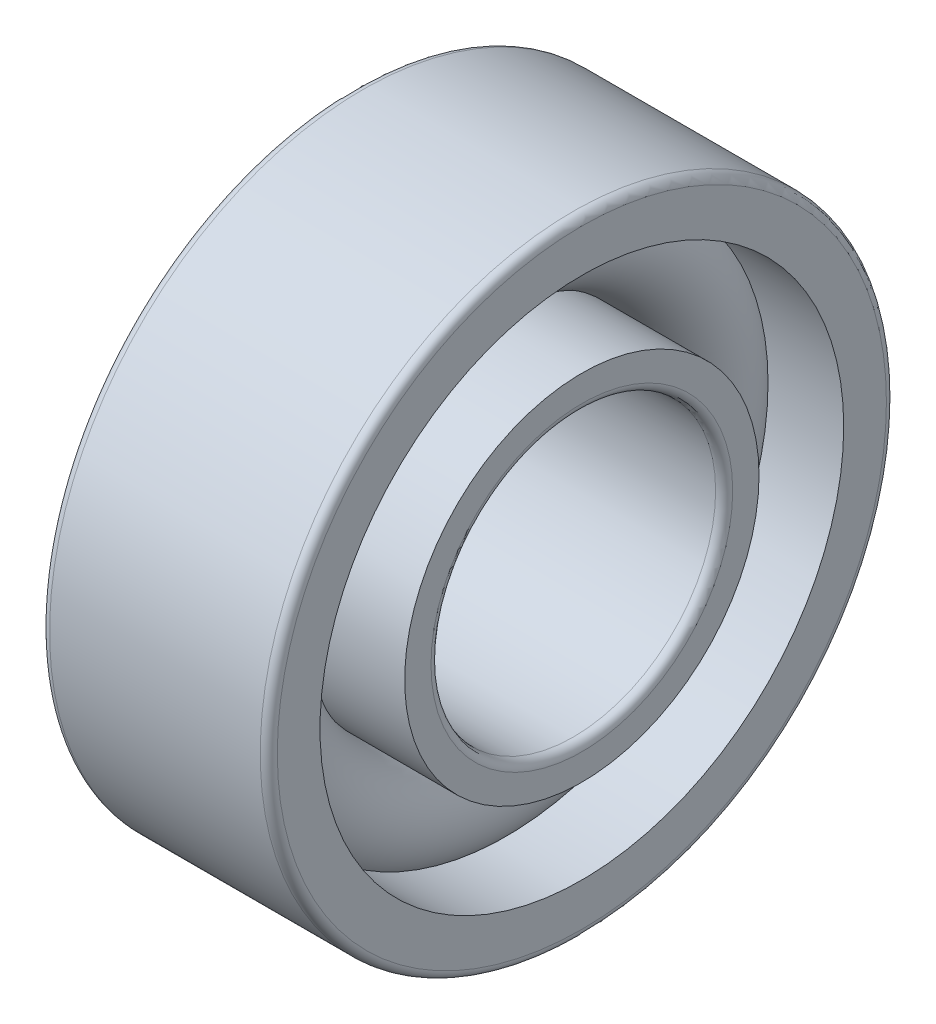
ISO-10303-21;
HEADER;
FILE_DESCRIPTION(('STEP AP214'),'2;1');
FILE_NAME('part.step','',(''),(''),'','','');
FILE_SCHEMA(('AUTOMOTIVE_DESIGN { 1 0 10303 214 1 1 1 1 }'));
ENDSEC;
DATA;
#1=APPLICATION_CONTEXT('core data for automotive mechanical design processes');
#2=APPLICATION_PROTOCOL_DEFINITION('international standard','automotive_design',2000,#1);
#3=PRODUCT_CONTEXT('',#1,'mechanical');
#4=PRODUCT('Part','Part','',(#3));
#5=PRODUCT_RELATED_PRODUCT_CATEGORY('part','',(#4));
#6=PRODUCT_DEFINITION_FORMATION('','',#4);
#7=PRODUCT_DEFINITION_CONTEXT('part definition',#1,'design');
#8=PRODUCT_DEFINITION('design','',#6,#7);
#9=PRODUCT_DEFINITION_SHAPE('','',#8);
#10=(LENGTH_UNIT() NAMED_UNIT(*) SI_UNIT(.MILLI.,.METRE.));
#11=(NAMED_UNIT(*) PLANE_ANGLE_UNIT() SI_UNIT($,.RADIAN.));
#12=(NAMED_UNIT(*) SI_UNIT($,.STERADIAN.) SOLID_ANGLE_UNIT());
#13=UNCERTAINTY_MEASURE_WITH_UNIT(LENGTH_MEASURE(1.E-05),#10,'distance_accuracy_value','');
#14=(GEOMETRIC_REPRESENTATION_CONTEXT(3) GLOBAL_UNCERTAINTY_ASSIGNED_CONTEXT((#13)) GLOBAL_UNIT_ASSIGNED_CONTEXT((#10,
#11,#12)) REPRESENTATION_CONTEXT('',''));
#15=CARTESIAN_POINT('',(0.,0.,0.));
#16=DIRECTION('',(0.,0.,1.));
#17=DIRECTION('',(1.,0.,0.));
#18=AXIS2_PLACEMENT_3D('',#15,#16,#17);
#19=CARTESIAN_POINT('',(-35.4553710150989,9.78232897185181,12.0633461283654));
#20=DIRECTION('',(-1.,0.,0.));
#21=DIRECTION('',(0.,0.,1.));
#22=AXIS2_PLACEMENT_3D('',#19,#20,#21);
#23=TOROIDAL_SURFACE('',#22,8.,1.8);
#24=CARTESIAN_POINT('',(-34.1137302285989,9.78232897185151,12.0633461283654));
#25=DIRECTION('',(-1.,0.,0.));
#26=DIRECTION('',(0.,0.,1.));
#27=AXIS2_PLACEMENT_3D('',#24,#25,#26);
#28=CIRCLE('',#27,9.2);
#29=CARTESIAN_POINT('',(-34.1137302285989,9.78232897185152,21.2633461283654));
#30=VERTEX_POINT('',#29);
#31=EDGE_CURVE('E43',#30,#30,#28,.F.);
#32=ORIENTED_EDGE('',*,*,#31,.T.);
#33=EDGE_LOOP('',(#32));
#34=FACE_BOUND('',#33,.T.);
#35=CARTESIAN_POINT('',(-35.1564144965214,9.78232897185134,12.0633461283651));
#36=DIRECTION('',(-1.,0.,0.));
#37=DIRECTION('',(0.,0.,1.));
#38=AXIS2_PLACEMENT_3D('',#35,#36,#37);
#39=CIRCLE('',#38,6.225);
#40=CARTESIAN_POINT('',(-35.1564144965214,9.78232897185135,18.2883461283651));
#41=VERTEX_POINT('',#40);
#42=EDGE_CURVE('E10',#41,#41,#39,.T.);
#43=ORIENTED_EDGE('',*,*,#42,.T.);
#44=EDGE_LOOP('',(#43));
#45=FACE_BOUND('',#44,.T.);
#46=ADVANCED_FACE('F39',(#34,#45),#23,.T.);
#47=CARTESIAN_POINT('',(-56.0928710150989,9.78232897185134,12.0633461283651));
#48=DIRECTION('',(1.,0.,0.));
#49=DIRECTION('',(0.,0.,-1.));
#50=AXIS2_PLACEMENT_3D('',#47,#48,#49);
#51=CYLINDRICAL_SURFACE('',#50,6.225);
#52=CARTESIAN_POINT('',(-31.4553710150987,9.78232897185162,12.0633461283652));
#53=DIRECTION('',(1.,0.,0.));
#54=DIRECTION('',(0.,0.,-1.));
#55=AXIS2_PLACEMENT_3D('',#52,#53,#54);
#56=CIRCLE('',#55,6.225);
#57=CARTESIAN_POINT('',(-31.4553710150987,9.78232897185161,5.83834612836516));
#58=VERTEX_POINT('',#57);
#59=EDGE_CURVE('E54',#58,#58,#56,.T.);
#60=ORIENTED_EDGE('',*,*,#59,.F.);
#61=EDGE_LOOP('',(#60));
#62=FACE_BOUND('',#61,.T.);
#63=ORIENTED_EDGE('',*,*,#42,.F.);
#64=EDGE_LOOP('',(#63));
#65=FACE_BOUND('',#64,.T.);
#66=ADVANCED_FACE('F103',(#62,#65),#51,.T.);
#67=CARTESIAN_POINT('',(-56.0928710150989,9.78232897185134,12.0633461283651));
#68=DIRECTION('',(1.,0.,0.));
#69=DIRECTION('',(0.,0.,-1.));
#70=AXIS2_PLACEMENT_3D('',#67,#68,#69);
#71=CYLINDRICAL_SURFACE('',#70,6.8);
#72=CARTESIAN_POINT('',(-39.4553710150989,9.78232897185173,12.0633461283655));
#73=DIRECTION('',(1.,0.,0.));
#74=DIRECTION('',(0.,0.,-1.));
#75=AXIS2_PLACEMENT_3D('',#72,#73,#74);
#76=CIRCLE('',#75,6.8);
#77=CARTESIAN_POINT('',(-39.4553710150989,9.78232897185172,5.26334612836549));
#78=VERTEX_POINT('',#77);
#79=EDGE_CURVE('E66',#78,#78,#76,.T.);
#80=ORIENTED_EDGE('',*,*,#79,.T.);
#81=EDGE_LOOP('',(#80));
#82=FACE_BOUND('',#81,.T.);
#83=CARTESIAN_POINT('',(-36.7970118015986,9.78232897185134,12.0633461283652));
#84=DIRECTION('',(1.,0.,0.));
#85=DIRECTION('',(0.,0.,-1.));
#86=AXIS2_PLACEMENT_3D('',#83,#84,#85);
#87=CIRCLE('',#86,6.8);
#88=CARTESIAN_POINT('',(-36.7970118015986,9.78232897185133,5.26334612836516));
#89=VERTEX_POINT('',#88);
#90=EDGE_CURVE('E48',#89,#89,#87,.T.);
#91=ORIENTED_EDGE('',*,*,#90,.F.);
#92=EDGE_LOOP('',(#91));
#93=FACE_BOUND('',#92,.T.);
#94=ADVANCED_FACE('F106',(#82,#93),#71,.T.);
#95=CARTESIAN_POINT('',(-31.4553710150989,15.0823289718513,12.0633461283653));
#96=DIRECTION('',(1.,0.,0.));
#97=DIRECTION('',(0.,0.,-1.));
#98=AXIS2_PLACEMENT_3D('',#95,#96,#97);
#99=PLANE('',#98);
#100=ORIENTED_EDGE('',*,*,#59,.T.);
#101=EDGE_LOOP('',(#100));
#102=FACE_BOUND('',#101,.T.);
#103=CARTESIAN_POINT('',(-31.4553710150987,9.78232897185162,12.0633461283652));
#104=DIRECTION('',(1.,0.,0.));
#105=DIRECTION('',(0.,0.,-1.));
#106=AXIS2_PLACEMENT_3D('',#103,#104,#105);
#107=CIRCLE('',#106,5.3);
#108=CARTESIAN_POINT('',(-31.4553710150987,9.78232897185161,6.76334612836516));
#109=VERTEX_POINT('',#108);
#110=EDGE_CURVE('E93',#109,#109,#107,.T.);
#111=ORIENTED_EDGE('',*,*,#110,.F.);
#112=EDGE_LOOP('',(#111));
#113=FACE_BOUND('',#112,.T.);
#114=ADVANCED_FACE('F100',(#102,#113),#99,.T.);
#115=CARTESIAN_POINT('',(-31.7553710150989,9.78232897185173,12.0633461283654));
#116=DIRECTION('',(1.,0.,0.));
#117=DIRECTION('',(0.,0.,-1.));
#118=AXIS2_PLACEMENT_3D('',#115,#116,#117);
#119=TOROIDAL_SURFACE('',#118,5.3,0.300000000000001);
#120=ORIENTED_EDGE('',*,*,#110,.T.);
#121=EDGE_LOOP('',(#120));
#122=FACE_BOUND('',#121,.T.);
#123=CARTESIAN_POINT('',(-31.7553710150989,9.78232897185173,12.0633461283654));
#124=DIRECTION('',(1.,0.,0.));
#125=DIRECTION('',(0.,0.,-1.));
#126=AXIS2_PLACEMENT_3D('',#123,#124,#125);
#127=CIRCLE('',#126,5.);
#128=CARTESIAN_POINT('',(-31.7553710150989,9.78232897185172,7.06334612836544));
#129=VERTEX_POINT('',#128);
#130=EDGE_CURVE('E89',#129,#129,#127,.T.);
#131=ORIENTED_EDGE('',*,*,#130,.F.);
#132=EDGE_LOOP('',(#131));
#133=FACE_BOUND('',#132,.T.);
#134=ADVANCED_FACE('F117',(#122,#133),#119,.T.);
#135=CARTESIAN_POINT('',(-56.0928710150989,9.78232897185134,12.0633461283651));
#136=DIRECTION('',(1.,0.,0.));
#137=DIRECTION('',(0.,0.,-1.));
#138=AXIS2_PLACEMENT_3D('',#135,#136,#137);
#139=CYLINDRICAL_SURFACE('',#138,5.);
#140=ORIENTED_EDGE('',*,*,#130,.T.);
#141=EDGE_LOOP('',(#140));
#142=FACE_BOUND('',#141,.T.);
#143=CARTESIAN_POINT('',(-39.1553710150986,9.78232897185137,12.0633461283654));
#144=DIRECTION('',(1.,0.,0.));
#145=DIRECTION('',(0.,0.,-1.));
#146=AXIS2_PLACEMENT_3D('',#143,#144,#145);
#147=CIRCLE('',#146,5.);
#148=CARTESIAN_POINT('',(-39.1553710150986,9.78232897185136,7.06334612836538));
#149=VERTEX_POINT('',#148);
#150=EDGE_CURVE('E85',#149,#149,#147,.T.);
#151=ORIENTED_EDGE('',*,*,#150,.F.);
#152=EDGE_LOOP('',(#151));
#153=FACE_BOUND('',#152,.T.);
#154=ADVANCED_FACE('F120',(#142,#153),#139,.F.);
#155=CARTESIAN_POINT('',(-39.1553710150986,9.78232897185137,12.0633461283654));
#156=DIRECTION('',(1.,0.,0.));
#157=DIRECTION('',(0.,0.,-1.));
#158=AXIS2_PLACEMENT_3D('',#155,#156,#157);
#159=TOROIDAL_SURFACE('',#158,5.3,0.300000000000001);
#160=ORIENTED_EDGE('',*,*,#150,.T.);
#161=EDGE_LOOP('',(#160));
#162=FACE_BOUND('',#161,.T.);
#163=CARTESIAN_POINT('',(-39.4553710150989,9.78232897185173,12.0633461283655));
#164=DIRECTION('',(1.,0.,0.));
#165=DIRECTION('',(0.,0.,-1.));
#166=AXIS2_PLACEMENT_3D('',#163,#164,#165);
#167=CIRCLE('',#166,5.3);
#168=CARTESIAN_POINT('',(-39.4553710150989,9.78232897185172,6.76334612836549));
#169=VERTEX_POINT('',#168);
#170=EDGE_CURVE('E81',#169,#169,#167,.T.);
#171=ORIENTED_EDGE('',*,*,#170,.F.);
#172=EDGE_LOOP('',(#171));
#173=FACE_BOUND('',#172,.T.);
#174=ADVANCED_FACE('F124',(#162,#173),#159,.T.);
#175=CARTESIAN_POINT('',(-39.4553710150987,16.5823289718514,12.0633461283652));
#176=DIRECTION('',(-1.,0.,0.));
#177=DIRECTION('',(0.,0.,1.));
#178=AXIS2_PLACEMENT_3D('',#175,#176,#177);
#179=PLANE('',#178);
#180=ORIENTED_EDGE('',*,*,#170,.T.);
#181=EDGE_LOOP('',(#180));
#182=FACE_BOUND('',#181,.T.);
#183=ORIENTED_EDGE('',*,*,#79,.F.);
#184=EDGE_LOOP('',(#183));
#185=FACE_BOUND('',#184,.T.);
#186=ADVANCED_FACE('F128',(#182,#185),#179,.T.);
#187=CARTESIAN_POINT('',(-35.7543275336763,9.78232897185134,12.0633461283654));
#188=DIRECTION('',(1.,0.,0.));
#189=DIRECTION('',(0.,0.,-1.));
#190=AXIS2_PLACEMENT_3D('',#187,#188,#189);
#191=CIRCLE('',#190,9.775);
#192=CARTESIAN_POINT('',(-35.7543275336763,9.78232897185133,2.28834612836537));
#193=VERTEX_POINT('',#192);
#194=EDGE_CURVE('E57',#193,#193,#191,.F.);
#195=ORIENTED_EDGE('',*,*,#194,.T.);
#196=EDGE_LOOP('',(#195));
#197=FACE_BOUND('',#196,.T.);
#198=ORIENTED_EDGE('',*,*,#90,.T.);
#199=EDGE_LOOP('',(#198));
#200=FACE_BOUND('',#199,.T.);
#201=ADVANCED_FACE('F41',(#197,#200),#23,.T.);
#202=CARTESIAN_POINT('',(-56.0928710150989,9.78232897185134,12.0633461283651));
#203=DIRECTION('',(1.,0.,0.));
#204=DIRECTION('',(0.,0.,-1.));
#205=AXIS2_PLACEMENT_3D('',#202,#203,#204);
#206=CYLINDRICAL_SURFACE('',#205,9.2);
#207=CARTESIAN_POINT('',(-31.4553710150987,9.78232897185162,12.0633461283652));
#208=DIRECTION('',(1.,0.,0.));
#209=DIRECTION('',(0.,0.,-1.));
#210=AXIS2_PLACEMENT_3D('',#207,#208,#209);
#211=CIRCLE('',#210,9.2);
#212=CARTESIAN_POINT('',(-31.4553710150987,9.78232897185161,2.86334612836515));
#213=VERTEX_POINT('',#212);
#214=EDGE_CURVE('E171',#213,#213,#211,.T.);
#215=ORIENTED_EDGE('',*,*,#214,.T.);
#216=EDGE_LOOP('',(#215));
#217=FACE_BOUND('',#216,.T.);
#218=ORIENTED_EDGE('',*,*,#31,.F.);
#219=EDGE_LOOP('',(#218));
#220=FACE_BOUND('',#219,.T.);
#221=ADVANCED_FACE('F150',(#217,#220),#206,.F.);
#222=CARTESIAN_POINT('',(-56.0928710150989,9.78232897185134,12.0633461283651));
#223=DIRECTION('',(1.,0.,0.));
#224=DIRECTION('',(0.,0.,-1.));
#225=AXIS2_PLACEMENT_3D('',#222,#223,#224);
#226=CYLINDRICAL_SURFACE('',#225,9.775);
#227=CARTESIAN_POINT('',(-39.4553710150989,9.78232897185173,12.0633461283655));
#228=DIRECTION('',(1.,0.,0.));
#229=DIRECTION('',(0.,0.,-1.));
#230=AXIS2_PLACEMENT_3D('',#227,#228,#229);
#231=CIRCLE('',#230,9.775);
#232=CARTESIAN_POINT('',(-39.4553710150989,9.78232897185172,2.28834612836548));
#233=VERTEX_POINT('',#232);
#234=EDGE_CURVE('E164',#233,#233,#231,.T.);
#235=ORIENTED_EDGE('',*,*,#234,.F.);
#236=EDGE_LOOP('',(#235));
#237=FACE_BOUND('',#236,.T.);
#238=ORIENTED_EDGE('',*,*,#194,.F.);
#239=EDGE_LOOP('',(#238));
#240=FACE_BOUND('',#239,.T.);
#241=ADVANCED_FACE('F137',(#237,#240),#226,.F.);
#242=CARTESIAN_POINT('',(-39.1553710150986,9.78232897185137,12.0633461283654));
#243=DIRECTION('',(1.,0.,0.));
#244=DIRECTION('',(0.,0.,-1.));
#245=AXIS2_PLACEMENT_3D('',#242,#243,#244);
#246=TOROIDAL_SURFACE('',#245,10.7,0.3);
#247=CARTESIAN_POINT('',(-39.4553710150989,9.78232897185173,12.0633461283655));
#248=DIRECTION('',(1.,0.,0.));
#249=DIRECTION('',(0.,0.,-1.));
#250=AXIS2_PLACEMENT_3D('',#247,#248,#249);
#251=CIRCLE('',#250,10.7);
#252=CARTESIAN_POINT('',(-39.4553710150989,9.78232897185172,1.36334612836548));
#253=VERTEX_POINT('',#252);
#254=EDGE_CURVE('E167',#253,#253,#251,.T.);
#255=ORIENTED_EDGE('',*,*,#254,.T.);
#256=EDGE_LOOP('',(#255));
#257=FACE_BOUND('',#256,.T.);
#258=CARTESIAN_POINT('',(-39.1553710150986,9.78232897185137,12.0633461283654));
#259=DIRECTION('',(1.,0.,0.));
#260=DIRECTION('',(0.,0.,-1.));
#261=AXIS2_PLACEMENT_3D('',#258,#259,#260);
#262=CIRCLE('',#261,11.);
#263=CARTESIAN_POINT('',(-39.1553710150986,9.78232897185136,1.06334612836537));
#264=VERTEX_POINT('',#263);
#265=EDGE_CURVE('E60',#264,#264,#262,.T.);
#266=ORIENTED_EDGE('',*,*,#265,.F.);
#267=EDGE_LOOP('',(#266));
#268=FACE_BOUND('',#267,.T.);
#269=ADVANCED_FACE('F133',(#257,#268),#246,.T.);
#270=CARTESIAN_POINT('',(-56.0928710150989,9.78232897185134,12.0633461283651));
#271=DIRECTION('',(1.,0.,0.));
#272=DIRECTION('',(0.,0.,-1.));
#273=AXIS2_PLACEMENT_3D('',#270,#271,#272);
#274=CYLINDRICAL_SURFACE('',#273,11.);
#275=ORIENTED_EDGE('',*,*,#265,.T.);
#276=EDGE_LOOP('',(#275));
#277=FACE_BOUND('',#276,.T.);
#278=CARTESIAN_POINT('',(-31.7553710150989,9.78232897185173,12.0633461283654));
#279=DIRECTION('',(1.,0.,0.));
#280=DIRECTION('',(0.,0.,-1.));
#281=AXIS2_PLACEMENT_3D('',#278,#279,#280);
#282=CIRCLE('',#281,11.);
#283=CARTESIAN_POINT('',(-31.7553710150989,9.78232897185172,1.06334612836543));
#284=VERTEX_POINT('',#283);
#285=EDGE_CURVE('E68',#284,#284,#282,.T.);
#286=ORIENTED_EDGE('',*,*,#285,.F.);
#287=EDGE_LOOP('',(#286));
#288=FACE_BOUND('',#287,.T.);
#289=ADVANCED_FACE('F136',(#277,#288),#274,.T.);
#290=CARTESIAN_POINT('',(-31.7553710150989,9.78232897185173,12.0633461283654));
#291=DIRECTION('',(1.,0.,0.));
#292=DIRECTION('',(0.,0.,-1.));
#293=AXIS2_PLACEMENT_3D('',#290,#291,#292);
#294=TOROIDAL_SURFACE('',#293,10.7,0.3);
#295=ORIENTED_EDGE('',*,*,#285,.T.);
#296=EDGE_LOOP('',(#295));
#297=FACE_BOUND('',#296,.T.);
#298=CARTESIAN_POINT('',(-31.4553710150987,9.78232897185162,12.0633461283652));
#299=DIRECTION('',(1.,0.,0.));
#300=DIRECTION('',(0.,0.,-1.));
#301=AXIS2_PLACEMENT_3D('',#298,#299,#300);
#302=CIRCLE('',#301,10.7);
#303=CARTESIAN_POINT('',(-31.4553710150987,9.78232897185161,1.36334612836515));
#304=VERTEX_POINT('',#303);
#305=EDGE_CURVE('E74',#304,#304,#302,.T.);
#306=ORIENTED_EDGE('',*,*,#305,.F.);
#307=EDGE_LOOP('',(#306));
#308=FACE_BOUND('',#307,.T.);
#309=ADVANCED_FACE('F141',(#297,#308),#294,.T.);
#310=CARTESIAN_POINT('',(-31.4553710150988,20.4823289718516,12.0633461283654));
#311=DIRECTION('',(1.,0.,0.));
#312=DIRECTION('',(0.,0.,-1.));
#313=AXIS2_PLACEMENT_3D('',#310,#311,#312);
#314=PLANE('',#313);
#315=ORIENTED_EDGE('',*,*,#305,.T.);
#316=EDGE_LOOP('',(#315));
#317=FACE_BOUND('',#316,.T.);
#318=ORIENTED_EDGE('',*,*,#214,.F.);
#319=EDGE_LOOP('',(#318));
#320=FACE_BOUND('',#319,.T.);
#321=ADVANCED_FACE('F144',(#317,#320),#314,.T.);
#322=CARTESIAN_POINT('',(-39.4553710150987,19.5573289718517,12.0633461283653));
#323=DIRECTION('',(-1.,0.,0.));
#324=DIRECTION('',(0.,0.,1.));
#325=AXIS2_PLACEMENT_3D('',#322,#323,#324);
#326=PLANE('',#325);
#327=ORIENTED_EDGE('',*,*,#234,.T.);
#328=EDGE_LOOP('',(#327));
#329=FACE_BOUND('',#328,.T.);
#330=ORIENTED_EDGE('',*,*,#254,.F.);
#331=EDGE_LOOP('',(#330));
#332=FACE_BOUND('',#331,.T.);
#333=ADVANCED_FACE('F148',(#329,#332),#326,.T.);
#334=CLOSED_SHELL('',(#46,#66,#94,#114,#134,#154,#174,#186,#201,#221,#241,#269,#289,#309,#321,#333));
#335=MANIFOLD_SOLID_BREP('B2',#334);
#336=ADVANCED_BREP_SHAPE_REPRESENTATION('',(#18,#335),#14);
#337=SHAPE_DEFINITION_REPRESENTATION(#9,#336);
ENDSEC;
END-ISO-10303-21;
